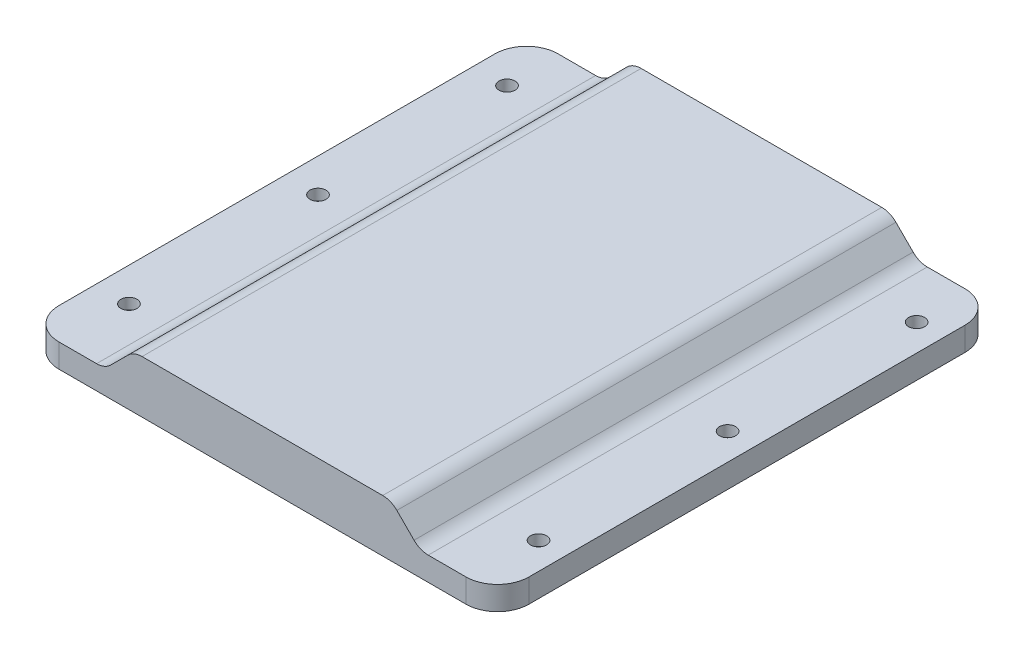
ISO-10303-21;
HEADER;
FILE_DESCRIPTION(('STEP AP214'),'2;1');
FILE_NAME('part.step','',(''),(''),'','','');
FILE_SCHEMA(('AUTOMOTIVE_DESIGN { 1 0 10303 214 1 1 1 1 }'));
ENDSEC;
DATA;
#1=APPLICATION_CONTEXT('core data for automotive mechanical design processes');
#2=APPLICATION_PROTOCOL_DEFINITION('international standard','automotive_design',2000,#1);
#3=PRODUCT_CONTEXT('',#1,'mechanical');
#4=PRODUCT('Part','Part','',(#3));
#5=PRODUCT_RELATED_PRODUCT_CATEGORY('part','',(#4));
#6=PRODUCT_DEFINITION_FORMATION('','',#4);
#7=PRODUCT_DEFINITION_CONTEXT('part definition',#1,'design');
#8=PRODUCT_DEFINITION('design','',#6,#7);
#9=PRODUCT_DEFINITION_SHAPE('','',#8);
#10=(LENGTH_UNIT() NAMED_UNIT(*) SI_UNIT(.MILLI.,.METRE.));
#11=(NAMED_UNIT(*) PLANE_ANGLE_UNIT() SI_UNIT($,.RADIAN.));
#12=(NAMED_UNIT(*) SI_UNIT($,.STERADIAN.) SOLID_ANGLE_UNIT());
#13=UNCERTAINTY_MEASURE_WITH_UNIT(LENGTH_MEASURE(1.E-05),#10,'distance_accuracy_value','');
#14=(GEOMETRIC_REPRESENTATION_CONTEXT(3) GLOBAL_UNCERTAINTY_ASSIGNED_CONTEXT((#13)) GLOBAL_UNIT_ASSIGNED_CONTEXT((#10,
#11,#12)) REPRESENTATION_CONTEXT('',''));
#15=CARTESIAN_POINT('',(0.,0.,0.));
#16=DIRECTION('',(0.,0.,1.));
#17=DIRECTION('',(1.,0.,0.));
#18=AXIS2_PLACEMENT_3D('',#15,#16,#17);
#19=CARTESIAN_POINT('',(-127.843162836829,-154.205542620135,120.));
#20=DIRECTION('',(0.,-1.,0.));
#21=DIRECTION('',(0.,0.,-1.));
#22=AXIS2_PLACEMENT_3D('',#19,#20,#21);
#23=CYLINDRICAL_SURFACE('',#22,5.1);
#24=CARTESIAN_POINT('',(-127.843162836829,-195.205542620135,120.));
#25=DIRECTION('',(0.,-1.,0.));
#26=DIRECTION('',(0.,0.,-1.));
#27=AXIS2_PLACEMENT_3D('',#24,#25,#26);
#28=CIRCLE('',#27,5.1);
#29=CARTESIAN_POINT('',(-127.843162836829,-195.205542620135,114.9));
#30=VERTEX_POINT('',#29);
#31=EDGE_CURVE('E395',#30,#30,#28,.T.);
#32=ORIENTED_EDGE('',*,*,#31,.F.);
#33=EDGE_LOOP('',(#32));
#34=FACE_BOUND('',#33,.T.);
#35=CARTESIAN_POINT('',(-127.843162836829,-202.205542620135,120.));
#36=DIRECTION('',(0.,-1.,0.));
#37=DIRECTION('',(0.,0.,-1.));
#38=AXIS2_PLACEMENT_3D('',#35,#36,#37);
#39=CIRCLE('',#38,5.1);
#40=CARTESIAN_POINT('',(-127.843162836829,-202.205542620135,114.9));
#41=VERTEX_POINT('',#40);
#42=EDGE_CURVE('E48',#41,#41,#39,.F.);
#43=ORIENTED_EDGE('',*,*,#42,.F.);
#44=EDGE_LOOP('',(#43));
#45=FACE_BOUND('',#44,.T.);
#46=ADVANCED_FACE('F44',(#34,#45),#23,.F.);
#47=CARTESIAN_POINT('',(-127.843162836829,-154.205542620135,0.));
#48=DIRECTION('',(0.,-1.,0.));
#49=DIRECTION('',(0.,0.,-1.));
#50=AXIS2_PLACEMENT_3D('',#47,#48,#49);
#51=CYLINDRICAL_SURFACE('',#50,5.1);
#52=CARTESIAN_POINT('',(-127.843162836829,-195.205542620135,0.));
#53=DIRECTION('',(0.,-1.,0.));
#54=DIRECTION('',(0.,0.,-1.));
#55=AXIS2_PLACEMENT_3D('',#52,#53,#54);
#56=CIRCLE('',#55,5.1);
#57=CARTESIAN_POINT('',(-127.843162836829,-195.205542620135,-5.1));
#58=VERTEX_POINT('',#57);
#59=EDGE_CURVE('E399',#58,#58,#56,.T.);
#60=ORIENTED_EDGE('',*,*,#59,.F.);
#61=EDGE_LOOP('',(#60));
#62=FACE_BOUND('',#61,.T.);
#63=CARTESIAN_POINT('',(-127.843162836829,-202.205542620135,0.));
#64=DIRECTION('',(0.,-1.,0.));
#65=DIRECTION('',(0.,0.,-1.));
#66=AXIS2_PLACEMENT_3D('',#63,#64,#65);
#67=CIRCLE('',#66,5.1);
#68=CARTESIAN_POINT('',(-127.843162836829,-202.205542620135,-5.1));
#69=VERTEX_POINT('',#68);
#70=EDGE_CURVE('E434',#69,#69,#67,.F.);
#71=ORIENTED_EDGE('',*,*,#70,.F.);
#72=EDGE_LOOP('',(#71));
#73=FACE_BOUND('',#72,.T.);
#74=ADVANCED_FACE('F446',(#62,#73),#51,.F.);
#75=CARTESIAN_POINT('',(-127.843162836829,-154.205542620135,-120.));
#76=DIRECTION('',(0.,-1.,0.));
#77=DIRECTION('',(0.,0.,-1.));
#78=AXIS2_PLACEMENT_3D('',#75,#76,#77);
#79=CYLINDRICAL_SURFACE('',#78,5.1);
#80=CARTESIAN_POINT('',(-127.843162836829,-195.205542620135,-120.));
#81=DIRECTION('',(0.,-1.,0.));
#82=DIRECTION('',(0.,0.,-1.));
#83=AXIS2_PLACEMENT_3D('',#80,#81,#82);
#84=CIRCLE('',#83,5.1);
#85=CARTESIAN_POINT('',(-127.843162836829,-195.205542620135,-125.1));
#86=VERTEX_POINT('',#85);
#87=EDGE_CURVE('E403',#86,#86,#84,.T.);
#88=ORIENTED_EDGE('',*,*,#87,.F.);
#89=EDGE_LOOP('',(#88));
#90=FACE_BOUND('',#89,.T.);
#91=CARTESIAN_POINT('',(-127.843162836829,-202.205542620135,-120.));
#92=DIRECTION('',(0.,-1.,0.));
#93=DIRECTION('',(0.,0.,-1.));
#94=AXIS2_PLACEMENT_3D('',#91,#92,#93);
#95=CIRCLE('',#94,5.1);
#96=CARTESIAN_POINT('',(-127.843162836829,-202.205542620135,-125.1));
#97=VERTEX_POINT('',#96);
#98=EDGE_CURVE('E431',#97,#97,#95,.F.);
#99=ORIENTED_EDGE('',*,*,#98,.F.);
#100=EDGE_LOOP('',(#99));
#101=FACE_BOUND('',#100,.T.);
#102=ADVANCED_FACE('F453',(#90,#101),#79,.F.);
#103=CARTESIAN_POINT('',(132.156837163171,-154.205542620135,-120.));
#104=DIRECTION('',(0.,-1.,0.));
#105=DIRECTION('',(0.,0.,-1.));
#106=AXIS2_PLACEMENT_3D('',#103,#104,#105);
#107=CYLINDRICAL_SURFACE('',#106,5.09999999999998);
#108=CARTESIAN_POINT('',(132.156837163171,-195.205542620135,-120.));
#109=DIRECTION('',(0.,-1.,0.));
#110=DIRECTION('',(0.,0.,-1.));
#111=AXIS2_PLACEMENT_3D('',#108,#109,#110);
#112=CIRCLE('',#111,5.09999999999998);
#113=CARTESIAN_POINT('',(132.156837163171,-195.205542620135,-125.1));
#114=VERTEX_POINT('',#113);
#115=EDGE_CURVE('E407',#114,#114,#112,.T.);
#116=ORIENTED_EDGE('',*,*,#115,.F.);
#117=EDGE_LOOP('',(#116));
#118=FACE_BOUND('',#117,.T.);
#119=CARTESIAN_POINT('',(132.156837163171,-202.205542620135,-120.));
#120=DIRECTION('',(0.,-1.,0.));
#121=DIRECTION('',(0.,0.,-1.));
#122=AXIS2_PLACEMENT_3D('',#119,#120,#121);
#123=CIRCLE('',#122,5.09999999999998);
#124=CARTESIAN_POINT('',(132.156837163171,-202.205542620135,-125.1));
#125=VERTEX_POINT('',#124);
#126=EDGE_CURVE('E427',#125,#125,#123,.F.);
#127=ORIENTED_EDGE('',*,*,#126,.F.);
#128=EDGE_LOOP('',(#127));
#129=FACE_BOUND('',#128,.T.);
#130=ADVANCED_FACE('F552',(#118,#129),#107,.F.);
#131=CARTESIAN_POINT('',(132.156837163171,-154.205542620135,120.));
#132=DIRECTION('',(0.,-1.,0.));
#133=DIRECTION('',(0.,0.,-1.));
#134=AXIS2_PLACEMENT_3D('',#131,#132,#133);
#135=CYLINDRICAL_SURFACE('',#134,5.09999999999998);
#136=CARTESIAN_POINT('',(132.156837163171,-195.205542620135,120.));
#137=DIRECTION('',(0.,-1.,0.));
#138=DIRECTION('',(0.,0.,-1.));
#139=AXIS2_PLACEMENT_3D('',#136,#137,#138);
#140=CIRCLE('',#139,5.09999999999998);
#141=CARTESIAN_POINT('',(132.156837163171,-195.205542620135,114.9));
#142=VERTEX_POINT('',#141);
#143=EDGE_CURVE('E411',#142,#142,#140,.T.);
#144=ORIENTED_EDGE('',*,*,#143,.F.);
#145=EDGE_LOOP('',(#144));
#146=FACE_BOUND('',#145,.T.);
#147=CARTESIAN_POINT('',(132.156837163171,-202.205542620135,120.));
#148=DIRECTION('',(0.,-1.,0.));
#149=DIRECTION('',(0.,0.,-1.));
#150=AXIS2_PLACEMENT_3D('',#147,#148,#149);
#151=CIRCLE('',#150,5.09999999999998);
#152=CARTESIAN_POINT('',(132.156837163171,-202.205542620135,114.9));
#153=VERTEX_POINT('',#152);
#154=EDGE_CURVE('E422',#153,#153,#151,.F.);
#155=ORIENTED_EDGE('',*,*,#154,.F.);
#156=EDGE_LOOP('',(#155));
#157=FACE_BOUND('',#156,.T.);
#158=ADVANCED_FACE('F555',(#146,#157),#135,.F.);
#159=CARTESIAN_POINT('',(132.156837163171,-154.205542620135,0.));
#160=DIRECTION('',(0.,-1.,0.));
#161=DIRECTION('',(0.,0.,-1.));
#162=AXIS2_PLACEMENT_3D('',#159,#160,#161);
#163=CYLINDRICAL_SURFACE('',#162,5.09999999999998);
#164=CARTESIAN_POINT('',(132.156837163171,-195.205542620135,0.));
#165=DIRECTION('',(0.,-1.,0.));
#166=DIRECTION('',(0.,0.,-1.));
#167=AXIS2_PLACEMENT_3D('',#164,#165,#166);
#168=CIRCLE('',#167,5.09999999999998);
#169=CARTESIAN_POINT('',(132.156837163171,-195.205542620135,-5.09999999999998));
#170=VERTEX_POINT('',#169);
#171=EDGE_CURVE('E391',#170,#170,#168,.T.);
#172=ORIENTED_EDGE('',*,*,#171,.F.);
#173=EDGE_LOOP('',(#172));
#174=FACE_BOUND('',#173,.T.);
#175=CARTESIAN_POINT('',(132.156837163171,-202.205542620135,0.));
#176=DIRECTION('',(0.,-1.,0.));
#177=DIRECTION('',(0.,0.,-1.));
#178=AXIS2_PLACEMENT_3D('',#175,#176,#177);
#179=CIRCLE('',#178,5.09999999999998);
#180=CARTESIAN_POINT('',(132.156837163171,-202.205542620135,-5.09999999999998));
#181=VERTEX_POINT('',#180);
#182=EDGE_CURVE('E418',#181,#181,#179,.F.);
#183=ORIENTED_EDGE('',*,*,#182,.F.);
#184=EDGE_LOOP('',(#183));
#185=FACE_BOUND('',#184,.T.);
#186=ADVANCED_FACE('F502',(#174,#185),#163,.F.);
#187=CARTESIAN_POINT('',(129.225,-210.205542620135,-133.670566263828));
#188=DIRECTION('',(0.,-1.,0.));
#189=DIRECTION('',(0.,0.,-1.));
#190=AXIS2_PLACEMENT_3D('',#187,#188,#189);
#191=PLANE('',#190);
#192=CARTESIAN_POINT('',(132.156837163171,-210.205542620135,0.));
#193=DIRECTION('',(0.,-1.,0.));
#194=DIRECTION('',(0.,0.,-1.));
#195=AXIS2_PLACEMENT_3D('',#192,#193,#194);
#196=CIRCLE('',#195,11.5);
#197=CARTESIAN_POINT('',(132.156837163171,-210.205542620135,-11.5));
#198=VERTEX_POINT('',#197);
#199=EDGE_CURVE('E642',#198,#198,#196,.T.);
#200=ORIENTED_EDGE('',*,*,#199,.F.);
#201=EDGE_LOOP('',(#200));
#202=FACE_BOUND('',#201,.T.);
#203=CARTESIAN_POINT('',(132.156837163171,-210.205542620135,120.));
#204=DIRECTION('',(0.,-1.,0.));
#205=DIRECTION('',(0.,0.,-1.));
#206=AXIS2_PLACEMENT_3D('',#203,#204,#205);
#207=CIRCLE('',#206,11.5);
#208=CARTESIAN_POINT('',(132.156837163171,-210.205542620135,108.5));
#209=VERTEX_POINT('',#208);
#210=EDGE_CURVE('E656',#209,#209,#207,.T.);
#211=ORIENTED_EDGE('',*,*,#210,.F.);
#212=EDGE_LOOP('',(#211));
#213=FACE_BOUND('',#212,.T.);
#214=CARTESIAN_POINT('',(-127.843162836829,-210.205542620135,-120.));
#215=DIRECTION('',(0.,-1.,0.));
#216=DIRECTION('',(0.,0.,-1.));
#217=AXIS2_PLACEMENT_3D('',#214,#215,#216);
#218=CIRCLE('',#217,11.5);
#219=CARTESIAN_POINT('',(-127.843162836829,-210.205542620135,-131.5));
#220=VERTEX_POINT('',#219);
#221=EDGE_CURVE('E621',#220,#220,#218,.T.);
#222=ORIENTED_EDGE('',*,*,#221,.F.);
#223=EDGE_LOOP('',(#222));
#224=FACE_BOUND('',#223,.T.);
#225=CARTESIAN_POINT('',(-127.843162836829,-210.205542620135,0.));
#226=DIRECTION('',(0.,-1.,0.));
#227=DIRECTION('',(0.,0.,-1.));
#228=AXIS2_PLACEMENT_3D('',#225,#226,#227);
#229=CIRCLE('',#228,11.5);
#230=CARTESIAN_POINT('',(-127.843162836829,-210.205542620135,-11.5));
#231=VERTEX_POINT('',#230);
#232=EDGE_CURVE('E622',#231,#231,#229,.T.);
#233=ORIENTED_EDGE('',*,*,#232,.F.);
#234=EDGE_LOOP('',(#233));
#235=FACE_BOUND('',#234,.T.);
#236=CARTESIAN_POINT('',(-127.843162836829,-210.205542620135,120.));
#237=DIRECTION('',(0.,-1.,0.));
#238=DIRECTION('',(0.,0.,-1.));
#239=AXIS2_PLACEMENT_3D('',#236,#237,#238);
#240=CIRCLE('',#239,11.5);
#241=CARTESIAN_POINT('',(-127.843162836829,-210.205542620135,108.5));
#242=VERTEX_POINT('',#241);
#243=EDGE_CURVE('E651',#242,#242,#240,.T.);
#244=ORIENTED_EDGE('',*,*,#243,.F.);
#245=EDGE_LOOP('',(#244));
#246=FACE_BOUND('',#245,.T.);
#247=CARTESIAN_POINT('',(132.156837163171,-210.205542620135,-120.));
#248=DIRECTION('',(0.,-1.,0.));
#249=DIRECTION('',(0.,0.,-1.));
#250=AXIS2_PLACEMENT_3D('',#247,#248,#249);
#251=CIRCLE('',#250,11.5);
#252=CARTESIAN_POINT('',(132.156837163171,-210.205542620135,-131.5));
#253=VERTEX_POINT('',#252);
#254=EDGE_CURVE('E247',#253,#253,#251,.T.);
#255=ORIENTED_EDGE('',*,*,#254,.F.);
#256=EDGE_LOOP('',(#255));
#257=FACE_BOUND('',#256,.T.);
#258=CARTESIAN_POINT('',(129.225,-210.205542620135,-133.670566263828));
#259=DIRECTION('',(0.,-1.,0.));
#260=DIRECTION('',(0.,0.,-1.));
#261=AXIS2_PLACEMENT_3D('',#258,#259,#260);
#262=CIRCLE('',#261,20.);
#263=CARTESIAN_POINT('',(129.225,-210.205542620135,-153.670566263828));
#264=VERTEX_POINT('',#263);
#265=CARTESIAN_POINT('',(149.225,-210.205542620135,-133.670566263828));
#266=VERTEX_POINT('',#265);
#267=EDGE_CURVE('E188',#264,#266,#262,.T.);
#268=ORIENTED_EDGE('',*,*,#267,.T.);
#269=DIRECTION('',(0.,0.,1.));
#270=VECTOR('',#269,1.);
#271=CARTESIAN_POINT('',(149.225,-210.205542620135,-133.670566263828));
#272=LINE('',#271,#270);
#273=CARTESIAN_POINT('',(149.225,-210.205542620135,143.130442631022));
#274=VERTEX_POINT('',#273);
#275=EDGE_CURVE('E260',#266,#274,#272,.T.);
#276=ORIENTED_EDGE('',*,*,#275,.T.);
#277=CARTESIAN_POINT('',(129.225,-210.205542620135,143.130442631022));
#278=DIRECTION('',(0.,-1.,0.));
#279=DIRECTION('',(0.,0.,-1.));
#280=AXIS2_PLACEMENT_3D('',#277,#278,#279);
#281=CIRCLE('',#280,20.);
#282=CARTESIAN_POINT('',(129.225,-210.205542620135,163.130442631022));
#283=VERTEX_POINT('',#282);
#284=EDGE_CURVE('E275',#274,#283,#281,.T.);
#285=ORIENTED_EDGE('',*,*,#284,.T.);
#286=DIRECTION('',(-1.,0.,0.));
#287=VECTOR('',#286,1.);
#288=CARTESIAN_POINT('',(129.225,-210.205542620135,163.130442631022));
#289=LINE('',#288,#287);
#290=CARTESIAN_POINT('',(-129.128934405313,-210.205542620135,163.130442631022));
#291=VERTEX_POINT('',#290);
#292=EDGE_CURVE('E329',#283,#291,#289,.T.);
#293=ORIENTED_EDGE('',*,*,#292,.T.);
#294=CARTESIAN_POINT('',(-129.128934405313,-210.205542620135,143.130442631022));
#295=DIRECTION('',(0.,-1.,0.));
#296=DIRECTION('',(0.,0.,-1.));
#297=AXIS2_PLACEMENT_3D('',#294,#295,#296);
#298=CIRCLE('',#297,20.);
#299=CARTESIAN_POINT('',(-149.128934405314,-210.205542620135,143.130442631022));
#300=VERTEX_POINT('',#299);
#301=EDGE_CURVE('E286',#291,#300,#298,.T.);
#302=ORIENTED_EDGE('',*,*,#301,.T.);
#303=DIRECTION('',(0.,0.,-1.));
#304=VECTOR('',#303,1.);
#305=CARTESIAN_POINT('',(-149.128934405314,-210.205542620135,143.130442631022));
#306=LINE('',#305,#304);
#307=CARTESIAN_POINT('',(-149.128934405314,-210.205542620135,-133.670566263828));
#308=VERTEX_POINT('',#307);
#309=EDGE_CURVE('E265',#300,#308,#306,.T.);
#310=ORIENTED_EDGE('',*,*,#309,.T.);
#311=CARTESIAN_POINT('',(-129.128934405313,-210.205542620135,-133.670566263828));
#312=DIRECTION('',(0.,-1.,0.));
#313=DIRECTION('',(0.,0.,-1.));
#314=AXIS2_PLACEMENT_3D('',#311,#312,#313);
#315=CIRCLE('',#314,20.);
#316=CARTESIAN_POINT('',(-129.128934405313,-210.205542620135,-153.670566263828));
#317=VERTEX_POINT('',#316);
#318=EDGE_CURVE('E307',#308,#317,#315,.T.);
#319=ORIENTED_EDGE('',*,*,#318,.T.);
#320=DIRECTION('',(1.,0.,0.));
#321=VECTOR('',#320,1.);
#322=CARTESIAN_POINT('',(-129.128934405313,-210.205542620135,-153.670566263828));
#323=LINE('',#322,#321);
#324=EDGE_CURVE('E254',#317,#264,#323,.T.);
#325=ORIENTED_EDGE('',*,*,#324,.T.);
#326=EDGE_LOOP('',(#268,#276,#285,#293,#302,#310,#319,#325));
#327=FACE_BOUND('',#326,.T.);
#328=ADVANCED_FACE('F477',(#202,#213,#224,#235,#246,#257,#327),#191,.T.);
#329=CARTESIAN_POINT('',(76.3840368888061,-189.565186447984,-153.670566263828));
#330=DIRECTION('',(0.,0.,1.));
#331=DIRECTION('',(1.,0.,0.));
#332=AXIS2_PLACEMENT_3D('',#329,#330,#331);
#333=CYLINDRICAL_SURFACE('',#332,12.7);
#334=DIRECTION('',(0.,0.,1.));
#335=VECTOR('',#334,1.);
#336=CARTESIAN_POINT('',(85.35965921701,-180.580298923844,-153.670566263828));
#337=LINE('',#336,#335);
#338=CARTESIAN_POINT('',(85.35965921701,-180.580298923844,-153.670566263828));
#339=VERTEX_POINT('',#338);
#340=CARTESIAN_POINT('',(85.35965921701,-180.580298923844,163.130442631022));
#341=VERTEX_POINT('',#340);
#342=EDGE_CURVE('E11',#339,#341,#337,.T.);
#343=ORIENTED_EDGE('',*,*,#342,.F.);
#344=CARTESIAN_POINT('',(76.3840368888061,-189.565186447984,-153.670566263828));
#345=DIRECTION('',(0.,0.,-1.));
#346=DIRECTION('',(1.,0.,0.));
#347=AXIS2_PLACEMENT_3D('',#344,#345,#346);
#348=CIRCLE('',#347,12.7);
#349=CARTESIAN_POINT('',(76.3840368888061,-176.865186447984,-153.670566263828));
#350=VERTEX_POINT('',#349);
#351=EDGE_CURVE('E221',#350,#339,#348,.T.);
#352=ORIENTED_EDGE('',*,*,#351,.F.);
#353=DIRECTION('',(0.,0.,1.));
#354=VECTOR('',#353,1.);
#355=CARTESIAN_POINT('',(76.384036888806,-176.865186447984,-153.670566263828));
#356=LINE('',#355,#354);
#357=CARTESIAN_POINT('',(76.3840368888061,-176.865186447984,163.130442631022));
#358=VERTEX_POINT('',#357);
#359=EDGE_CURVE('E135',#350,#358,#356,.T.);
#360=ORIENTED_EDGE('',*,*,#359,.T.);
#361=CARTESIAN_POINT('',(76.3840368888061,-189.565186447984,163.130442631022));
#362=DIRECTION('',(0.,0.,-1.));
#363=DIRECTION('',(1.,0.,0.));
#364=AXIS2_PLACEMENT_3D('',#361,#362,#363);
#365=CIRCLE('',#364,12.7);
#366=EDGE_CURVE('E218',#358,#341,#365,.T.);
#367=ORIENTED_EDGE('',*,*,#366,.T.);
#368=EDGE_LOOP('',(#343,#352,#360,#367));
#369=FACE_BOUND('',#368,.T.);
#370=ADVANCED_FACE('F216',(#369),#333,.T.);
#371=CARTESIAN_POINT('',(105.256674882048,-195.205542620135,-153.670566263828));
#372=DIRECTION('',(0.,-1.,0.));
#373=DIRECTION('',(0.,0.,-1.));
#374=AXIS2_PLACEMENT_3D('',#371,#372,#373);
#375=PLANE('',#374);
#376=ORIENTED_EDGE('',*,*,#171,.T.);
#377=EDGE_LOOP('',(#376));
#378=FACE_BOUND('',#377,.T.);
#379=ORIENTED_EDGE('',*,*,#143,.T.);
#380=EDGE_LOOP('',(#379));
#381=FACE_BOUND('',#380,.T.);
#382=ORIENTED_EDGE('',*,*,#115,.T.);
#383=EDGE_LOOP('',(#382));
#384=FACE_BOUND('',#383,.T.);
#385=DIRECTION('',(-1.,0.,0.));
#386=VECTOR('',#385,1.);
#387=CARTESIAN_POINT('',(185.,-195.205542620135,163.130442631022));
#388=LINE('',#387,#386);
#389=CARTESIAN_POINT('',(129.225,-195.205542620135,163.130442631022));
#390=VERTEX_POINT('',#389);
#391=CARTESIAN_POINT('',(105.256674882048,-195.205542620135,163.130442631022));
#392=VERTEX_POINT('',#391);
#393=EDGE_CURVE('E328',#390,#392,#388,.T.);
#394=ORIENTED_EDGE('',*,*,#393,.F.);
#395=CARTESIAN_POINT('',(129.225,-195.205542620135,143.130442631022));
#396=DIRECTION('',(0.,1.,0.));
#397=DIRECTION('',(0.,0.,-1.));
#398=AXIS2_PLACEMENT_3D('',#395,#396,#397);
#399=CIRCLE('',#398,20.);
#400=CARTESIAN_POINT('',(149.225,-195.205542620135,143.130442631022));
#401=VERTEX_POINT('',#400);
#402=EDGE_CURVE('E278',#390,#401,#399,.T.);
#403=ORIENTED_EDGE('',*,*,#402,.T.);
#404=DIRECTION('',(0.,0.,1.));
#405=VECTOR('',#404,1.);
#406=CARTESIAN_POINT('',(149.225,-195.205542620135,-153.670566263828));
#407=LINE('',#406,#405);
#408=CARTESIAN_POINT('',(149.225,-195.205542620135,-133.670566263828));
#409=VERTEX_POINT('',#408);
#410=EDGE_CURVE('E259',#409,#401,#407,.T.);
#411=ORIENTED_EDGE('',*,*,#410,.F.);
#412=CARTESIAN_POINT('',(129.225,-195.205542620135,-133.670566263828));
#413=DIRECTION('',(0.,1.,0.));
#414=DIRECTION('',(0.,0.,-1.));
#415=AXIS2_PLACEMENT_3D('',#412,#413,#414);
#416=CIRCLE('',#415,20.);
#417=CARTESIAN_POINT('',(129.225,-195.205542620135,-153.670566263828));
#418=VERTEX_POINT('',#417);
#419=EDGE_CURVE('E200',#409,#418,#416,.T.);
#420=ORIENTED_EDGE('',*,*,#419,.T.);
#421=DIRECTION('',(1.,0.,0.));
#422=VECTOR('',#421,1.);
#423=CARTESIAN_POINT('',(105.256674882048,-195.205542620135,-153.670566263828));
#424=LINE('',#423,#422);
#425=CARTESIAN_POINT('',(105.256674882048,-195.205542620135,-153.670566263828));
#426=VERTEX_POINT('',#425);
#427=EDGE_CURVE('E322',#426,#418,#424,.T.);
#428=ORIENTED_EDGE('',*,*,#427,.F.);
#429=DIRECTION('',(0.,0.,1.));
#430=VECTOR('',#429,1.);
#431=CARTESIAN_POINT('',(105.256674882048,-195.205542620135,-153.670566263828));
#432=LINE('',#431,#430);
#433=EDGE_CURVE('E299',#426,#392,#432,.T.);
#434=ORIENTED_EDGE('',*,*,#433,.T.);
#435=EDGE_LOOP('',(#394,#403,#411,#420,#428,#434));
#436=FACE_BOUND('',#435,.T.);
#437=ADVANCED_FACE('F46',(#378,#381,#384,#436),#375,.F.);
#438=CARTESIAN_POINT('',(96.2810525538444,-191.490430144275,-153.670566263828));
#439=DIRECTION('',(-0.7067419156066,-0.707471458593711,0.));
#440=DIRECTION('',(-0.707471458593711,0.7067419156066,0.));
#441=AXIS2_PLACEMENT_3D('',#438,#439,#440);
#442=PLANE('',#441);
#443=DIRECTION('',(0.,0.,1.));
#444=VECTOR('',#443,1.);
#445=CARTESIAN_POINT('',(96.2810525538444,-191.490430144275,-153.670566263828));
#446=LINE('',#445,#444);
#447=CARTESIAN_POINT('',(96.2810525538444,-191.490430144275,-153.670566263828));
#448=VERTEX_POINT('',#447);
#449=CARTESIAN_POINT('',(96.2810525538444,-191.490430144275,163.130442631022));
#450=VERTEX_POINT('',#449);
#451=EDGE_CURVE('E55',#448,#450,#446,.T.);
#452=ORIENTED_EDGE('',*,*,#451,.F.);
#453=DIRECTION('',(0.707471458593711,-0.7067419156066,0.));
#454=VECTOR('',#453,1.);
#455=CARTESIAN_POINT('',(96.2810525538444,-191.490430144275,-153.670566263828));
#456=LINE('',#455,#454);
#457=EDGE_CURVE('E323',#339,#448,#456,.T.);
#458=ORIENTED_EDGE('',*,*,#457,.F.);
#459=ORIENTED_EDGE('',*,*,#342,.T.);
#460=DIRECTION('',(0.707471458593711,-0.7067419156066,0.));
#461=VECTOR('',#460,1.);
#462=CARTESIAN_POINT('',(96.2810525538444,-191.490430144275,163.130442631022));
#463=LINE('',#462,#461);
#464=EDGE_CURVE('E238',#341,#450,#463,.T.);
#465=ORIENTED_EDGE('',*,*,#464,.T.);
#466=EDGE_LOOP('',(#452,#458,#459,#465));
#467=FACE_BOUND('',#466,.T.);
#468=ADVANCED_FACE('F473',(#467),#442,.F.);
#469=CARTESIAN_POINT('',(105.256674882048,-182.505542620135,-153.670566263828));
#470=DIRECTION('',(0.,0.,1.));
#471=DIRECTION('',(1.,0.,0.));
#472=AXIS2_PLACEMENT_3D('',#469,#470,#471);
#473=CYLINDRICAL_SURFACE('',#472,12.7);
#474=ORIENTED_EDGE('',*,*,#433,.F.);
#475=CARTESIAN_POINT('',(105.256674882048,-182.505542620135,-153.670566263828));
#476=DIRECTION('',(0.,0.,1.));
#477=DIRECTION('',(1.,0.,0.));
#478=AXIS2_PLACEMENT_3D('',#475,#476,#477);
#479=CIRCLE('',#478,12.7);
#480=EDGE_CURVE('E318',#448,#426,#479,.T.);
#481=ORIENTED_EDGE('',*,*,#480,.F.);
#482=ORIENTED_EDGE('',*,*,#451,.T.);
#483=CARTESIAN_POINT('',(105.256674882048,-182.505542620135,163.130442631022));
#484=DIRECTION('',(0.,0.,1.));
#485=DIRECTION('',(1.,0.,0.));
#486=AXIS2_PLACEMENT_3D('',#483,#484,#485);
#487=CIRCLE('',#486,12.7);
#488=EDGE_CURVE('E243',#450,#392,#487,.T.);
#489=ORIENTED_EDGE('',*,*,#488,.T.);
#490=EDGE_LOOP('',(#474,#481,#482,#489));
#491=FACE_BOUND('',#490,.T.);
#492=ADVANCED_FACE('F470',(#491),#473,.F.);
#493=CARTESIAN_POINT('',(-85.3596592170099,-180.580298923844,-153.670566263828));
#494=DIRECTION('',(0.7067419156066,-0.707471458593711,0.));
#495=DIRECTION('',(0.,0.,-1.));
#496=AXIS2_PLACEMENT_3D('',#493,#494,#495);
#497=PLANE('',#496);
#498=DIRECTION('',(0.,0.,1.));
#499=VECTOR('',#498,1.);
#500=CARTESIAN_POINT('',(-85.3596592170099,-180.580298923844,-153.670566263828));
#501=LINE('',#500,#499);
#502=CARTESIAN_POINT('',(-85.3596592170099,-180.580298923844,-153.670566263828));
#503=VERTEX_POINT('',#502);
#504=CARTESIAN_POINT('',(-85.3596592170099,-180.580298923844,163.130442631022));
#505=VERTEX_POINT('',#504);
#506=EDGE_CURVE('E297',#503,#505,#501,.T.);
#507=ORIENTED_EDGE('',*,*,#506,.F.);
#508=DIRECTION('',(0.707471458593711,0.7067419156066,0.));
#509=VECTOR('',#508,1.);
#510=CARTESIAN_POINT('',(-85.3596592170099,-180.580298923844,-153.670566263828));
#511=LINE('',#510,#509);
#512=CARTESIAN_POINT('',(-96.2810525538443,-191.490430144275,-153.670566263828));
#513=VERTEX_POINT('',#512);
#514=EDGE_CURVE('E283',#513,#503,#511,.T.);
#515=ORIENTED_EDGE('',*,*,#514,.F.);
#516=DIRECTION('',(0.,0.,1.));
#517=VECTOR('',#516,1.);
#518=CARTESIAN_POINT('',(-96.2810525538443,-191.490430144275,-153.670566263828));
#519=LINE('',#518,#517);
#520=CARTESIAN_POINT('',(-96.2810525538443,-191.490430144275,163.130442631022));
#521=VERTEX_POINT('',#520);
#522=EDGE_CURVE('E296',#513,#521,#519,.T.);
#523=ORIENTED_EDGE('',*,*,#522,.T.);
#524=DIRECTION('',(0.707471458593711,0.7067419156066,0.));
#525=VECTOR('',#524,1.);
#526=CARTESIAN_POINT('',(-85.3596592170099,-180.580298923844,163.130442631022));
#527=LINE('',#526,#525);
#528=EDGE_CURVE('E308',#521,#505,#527,.T.);
#529=ORIENTED_EDGE('',*,*,#528,.T.);
#530=EDGE_LOOP('',(#507,#515,#523,#529));
#531=FACE_BOUND('',#530,.T.);
#532=ADVANCED_FACE('F469',(#531),#497,.F.);
#533=CARTESIAN_POINT('',(-76.3840368888061,-189.565186447984,-153.670566263828));
#534=DIRECTION('',(0.,0.,1.));
#535=DIRECTION('',(1.,0.,0.));
#536=AXIS2_PLACEMENT_3D('',#533,#534,#535);
#537=CYLINDRICAL_SURFACE('',#536,12.7);
#538=DIRECTION('',(0.,0.,1.));
#539=VECTOR('',#538,1.);
#540=CARTESIAN_POINT('',(-76.3840368888062,-176.865186447984,-153.670566263828));
#541=LINE('',#540,#539);
#542=CARTESIAN_POINT('',(-76.3840368888062,-176.865186447984,-153.670566263828));
#543=VERTEX_POINT('',#542);
#544=CARTESIAN_POINT('',(-76.3840368888061,-176.865186447984,163.130442631022));
#545=VERTEX_POINT('',#544);
#546=EDGE_CURVE('E151',#543,#545,#541,.T.);
#547=ORIENTED_EDGE('',*,*,#546,.F.);
#548=CARTESIAN_POINT('',(-76.3840368888061,-189.565186447984,-153.670566263828));
#549=DIRECTION('',(0.,0.,-1.));
#550=DIRECTION('',(1.,0.,0.));
#551=AXIS2_PLACEMENT_3D('',#548,#549,#550);
#552=CIRCLE('',#551,12.7);
#553=EDGE_CURVE('E330',#503,#543,#552,.T.);
#554=ORIENTED_EDGE('',*,*,#553,.F.);
#555=ORIENTED_EDGE('',*,*,#506,.T.);
#556=CARTESIAN_POINT('',(-76.3840368888061,-189.565186447984,163.130442631022));
#557=DIRECTION('',(0.,0.,-1.));
#558=DIRECTION('',(1.,0.,0.));
#559=AXIS2_PLACEMENT_3D('',#556,#557,#558);
#560=CIRCLE('',#559,12.7);
#561=EDGE_CURVE('E232',#505,#545,#560,.T.);
#562=ORIENTED_EDGE('',*,*,#561,.T.);
#563=EDGE_LOOP('',(#547,#554,#555,#562));
#564=FACE_BOUND('',#563,.T.);
#565=ADVANCED_FACE('F465',(#564),#537,.T.);
#566=CARTESIAN_POINT('',(-105.256674882048,-182.505542620135,-153.670566263828));
#567=DIRECTION('',(0.,0.,1.));
#568=DIRECTION('',(1.,0.,0.));
#569=AXIS2_PLACEMENT_3D('',#566,#567,#568);
#570=CYLINDRICAL_SURFACE('',#569,12.7);
#571=ORIENTED_EDGE('',*,*,#522,.F.);
#572=CARTESIAN_POINT('',(-105.256674882048,-182.505542620135,-153.670566263828));
#573=DIRECTION('',(0.,0.,1.));
#574=DIRECTION('',(1.,0.,0.));
#575=AXIS2_PLACEMENT_3D('',#572,#573,#574);
#576=CIRCLE('',#575,12.7);
#577=CARTESIAN_POINT('',(-105.256674882048,-195.205542620135,-153.670566263828));
#578=VERTEX_POINT('',#577);
#579=EDGE_CURVE('E279',#578,#513,#576,.T.);
#580=ORIENTED_EDGE('',*,*,#579,.F.);
#581=DIRECTION('',(0.,0.,1.));
#582=VECTOR('',#581,1.);
#583=CARTESIAN_POINT('',(-105.256674882048,-195.205542620135,-153.670566263828));
#584=LINE('',#583,#582);
#585=CARTESIAN_POINT('',(-105.256674882048,-195.205542620135,163.130442631022));
#586=VERTEX_POINT('',#585);
#587=EDGE_CURVE('E293',#578,#586,#584,.T.);
#588=ORIENTED_EDGE('',*,*,#587,.T.);
#589=CARTESIAN_POINT('',(-105.256674882048,-182.505542620135,163.130442631022));
#590=DIRECTION('',(0.,0.,1.));
#591=DIRECTION('',(1.,0.,0.));
#592=AXIS2_PLACEMENT_3D('',#589,#590,#591);
#593=CIRCLE('',#592,12.7);
#594=EDGE_CURVE('E312',#586,#521,#593,.T.);
#595=ORIENTED_EDGE('',*,*,#594,.T.);
#596=EDGE_LOOP('',(#571,#580,#588,#595));
#597=FACE_BOUND('',#596,.T.);
#598=ADVANCED_FACE('F468',(#597),#570,.F.);
#599=CARTESIAN_POINT('',(-166.497256742306,-195.205542620135,-153.670566263828));
#600=DIRECTION('',(0.,-1.,0.));
#601=DIRECTION('',(0.,0.,-1.));
#602=AXIS2_PLACEMENT_3D('',#599,#600,#601);
#603=PLANE('',#602);
#604=ORIENTED_EDGE('',*,*,#87,.T.);
#605=EDGE_LOOP('',(#604));
#606=FACE_BOUND('',#605,.T.);
#607=ORIENTED_EDGE('',*,*,#59,.T.);
#608=EDGE_LOOP('',(#607));
#609=FACE_BOUND('',#608,.T.);
#610=ORIENTED_EDGE('',*,*,#31,.T.);
#611=EDGE_LOOP('',(#610));
#612=FACE_BOUND('',#611,.T.);
#613=DIRECTION('',(0.,0.,-1.));
#614=VECTOR('',#613,1.);
#615=CARTESIAN_POINT('',(-149.128934405314,-195.205542620135,-153.670566263828));
#616=LINE('',#615,#614);
#617=CARTESIAN_POINT('',(-149.128934405314,-195.205542620135,143.130442631022));
#618=VERTEX_POINT('',#617);
#619=CARTESIAN_POINT('',(-149.128934405313,-195.205542620135,-133.670566263828));
#620=VERTEX_POINT('',#619);
#621=EDGE_CURVE('E270',#618,#620,#616,.T.);
#622=ORIENTED_EDGE('',*,*,#621,.F.);
#623=CARTESIAN_POINT('',(-129.128934405313,-195.205542620135,143.130442631022));
#624=DIRECTION('',(0.,1.,0.));
#625=DIRECTION('',(0.,0.,-1.));
#626=AXIS2_PLACEMENT_3D('',#623,#624,#625);
#627=CIRCLE('',#626,20.);
#628=CARTESIAN_POINT('',(-129.128934405313,-195.205542620135,163.130442631022));
#629=VERTEX_POINT('',#628);
#630=EDGE_CURVE('E224',#618,#629,#627,.T.);
#631=ORIENTED_EDGE('',*,*,#630,.T.);
#632=DIRECTION('',(-1.,0.,0.));
#633=VECTOR('',#632,1.);
#634=CARTESIAN_POINT('',(185.,-195.205542620135,163.130442631022));
#635=LINE('',#634,#633);
#636=EDGE_CURVE('E348',#586,#629,#635,.T.);
#637=ORIENTED_EDGE('',*,*,#636,.F.);
#638=ORIENTED_EDGE('',*,*,#587,.F.);
#639=DIRECTION('',(1.,0.,0.));
#640=VECTOR('',#639,1.);
#641=CARTESIAN_POINT('',(-166.497256742306,-195.205542620135,-153.670566263828));
#642=LINE('',#641,#640);
#643=CARTESIAN_POINT('',(-129.128934405313,-195.205542620135,-153.670566263828));
#644=VERTEX_POINT('',#643);
#645=EDGE_CURVE('E253',#644,#578,#642,.T.);
#646=ORIENTED_EDGE('',*,*,#645,.F.);
#647=CARTESIAN_POINT('',(-129.128934405313,-195.205542620135,-133.670566263828));
#648=DIRECTION('',(0.,1.,0.));
#649=DIRECTION('',(0.,0.,-1.));
#650=AXIS2_PLACEMENT_3D('',#647,#648,#649);
#651=CIRCLE('',#650,20.);
#652=EDGE_CURVE('E69',#644,#620,#651,.T.);
#653=ORIENTED_EDGE('',*,*,#652,.T.);
#654=EDGE_LOOP('',(#622,#631,#637,#638,#646,#653));
#655=FACE_BOUND('',#654,.T.);
#656=ADVANCED_FACE('F498',(#606,#609,#612,#655),#603,.F.);
#657=CARTESIAN_POINT('',(129.225,-176.865186447984,-133.670566263828));
#658=DIRECTION('',(0.,1.,0.));
#659=DIRECTION('',(1.,0.,0.));
#660=AXIS2_PLACEMENT_3D('',#657,#658,#659);
#661=PLANE('',#660);
#662=DIRECTION('',(1.,0.,0.));
#663=VECTOR('',#662,1.);
#664=CARTESIAN_POINT('',(129.225,-176.865186447984,163.130442631022));
#665=LINE('',#664,#663);
#666=EDGE_CURVE('E227',#545,#358,#665,.T.);
#667=ORIENTED_EDGE('',*,*,#666,.T.);
#668=ORIENTED_EDGE('',*,*,#359,.F.);
#669=DIRECTION('',(-1.,0.,0.));
#670=VECTOR('',#669,1.);
#671=CARTESIAN_POINT('',(129.225,-176.865186447984,-153.670566263828));
#672=LINE('',#671,#670);
#673=EDGE_CURVE('E334',#350,#543,#672,.T.);
#674=ORIENTED_EDGE('',*,*,#673,.T.);
#675=ORIENTED_EDGE('',*,*,#546,.T.);
#676=EDGE_LOOP('',(#667,#668,#674,#675));
#677=FACE_BOUND('',#676,.T.);
#678=ADVANCED_FACE('F228',(#677),#661,.T.);
#679=CARTESIAN_POINT('',(-129.128934405313,-195.205542620135,143.130442631022));
#680=DIRECTION('',(0.,-1.,0.));
#681=DIRECTION('',(0.,0.,-1.));
#682=AXIS2_PLACEMENT_3D('',#679,#680,#681);
#683=CYLINDRICAL_SURFACE('',#682,20.);
#684=DIRECTION('',(0.,1.,0.));
#685=VECTOR('',#684,1.);
#686=CARTESIAN_POINT('',(-149.128934405314,-195.205542620135,143.130442631022));
#687=LINE('',#686,#685);
#688=EDGE_CURVE('E269',#300,#618,#687,.T.);
#689=ORIENTED_EDGE('',*,*,#688,.F.);
#690=ORIENTED_EDGE('',*,*,#301,.F.);
#691=DIRECTION('',(0.,-1.,0.));
#692=VECTOR('',#691,1.);
#693=CARTESIAN_POINT('',(-129.128934405313,-195.205542620135,163.130442631022));
#694=LINE('',#693,#692);
#695=EDGE_CURVE('E303',#629,#291,#694,.T.);
#696=ORIENTED_EDGE('',*,*,#695,.F.);
#697=ORIENTED_EDGE('',*,*,#630,.F.);
#698=EDGE_LOOP('',(#689,#690,#696,#697));
#699=FACE_BOUND('',#698,.T.);
#700=ADVANCED_FACE('F509',(#699),#683,.T.);
#701=CARTESIAN_POINT('',(129.225,-195.205542620135,143.130442631022));
#702=DIRECTION('',(0.,1.,0.));
#703=DIRECTION('',(0.,0.,1.));
#704=AXIS2_PLACEMENT_3D('',#701,#702,#703);
#705=CYLINDRICAL_SURFACE('',#704,20.);
#706=DIRECTION('',(0.,1.,0.));
#707=VECTOR('',#706,1.);
#708=CARTESIAN_POINT('',(129.225,-195.205542620135,163.130442631022));
#709=LINE('',#708,#707);
#710=EDGE_CURVE('E324',#283,#390,#709,.T.);
#711=ORIENTED_EDGE('',*,*,#710,.F.);
#712=ORIENTED_EDGE('',*,*,#284,.F.);
#713=DIRECTION('',(0.,-1.,0.));
#714=VECTOR('',#713,1.);
#715=CARTESIAN_POINT('',(149.225,-195.205542620135,143.130442631022));
#716=LINE('',#715,#714);
#717=EDGE_CURVE('E261',#401,#274,#716,.T.);
#718=ORIENTED_EDGE('',*,*,#717,.F.);
#719=ORIENTED_EDGE('',*,*,#402,.F.);
#720=EDGE_LOOP('',(#711,#712,#718,#719));
#721=FACE_BOUND('',#720,.T.);
#722=ADVANCED_FACE('F484',(#721),#705,.T.);
#723=CARTESIAN_POINT('',(129.225,-195.205542620135,-133.670566263828));
#724=DIRECTION('',(0.,-1.,0.));
#725=DIRECTION('',(0.,0.,-1.));
#726=AXIS2_PLACEMENT_3D('',#723,#724,#725);
#727=CYLINDRICAL_SURFACE('',#726,20.);
#728=DIRECTION('',(0.,1.,0.));
#729=VECTOR('',#728,1.);
#730=CARTESIAN_POINT('',(149.225,-195.205542620135,-133.670566263828));
#731=LINE('',#730,#729);
#732=EDGE_CURVE('E255',#266,#409,#731,.T.);
#733=ORIENTED_EDGE('',*,*,#732,.F.);
#734=ORIENTED_EDGE('',*,*,#267,.F.);
#735=DIRECTION('',(0.,-1.,0.));
#736=VECTOR('',#735,1.);
#737=CARTESIAN_POINT('',(129.225,-195.205542620135,-153.670566263828));
#738=LINE('',#737,#736);
#739=EDGE_CURVE('E289',#418,#264,#738,.T.);
#740=ORIENTED_EDGE('',*,*,#739,.F.);
#741=ORIENTED_EDGE('',*,*,#419,.F.);
#742=EDGE_LOOP('',(#733,#734,#740,#741));
#743=FACE_BOUND('',#742,.T.);
#744=ADVANCED_FACE('F481',(#743),#727,.T.);
#745=CARTESIAN_POINT('',(-129.128934405313,-195.205542620135,-133.670566263828));
#746=DIRECTION('',(0.,1.,0.));
#747=DIRECTION('',(0.,0.,1.));
#748=AXIS2_PLACEMENT_3D('',#745,#746,#747);
#749=CYLINDRICAL_SURFACE('',#748,20.);
#750=DIRECTION('',(0.,1.,0.));
#751=VECTOR('',#750,1.);
#752=CARTESIAN_POINT('',(-129.128934405313,-195.205542620135,-153.670566263828));
#753=LINE('',#752,#751);
#754=EDGE_CURVE('E249',#317,#644,#753,.T.);
#755=ORIENTED_EDGE('',*,*,#754,.F.);
#756=ORIENTED_EDGE('',*,*,#318,.F.);
#757=DIRECTION('',(0.,-1.,0.));
#758=VECTOR('',#757,1.);
#759=CARTESIAN_POINT('',(-149.128934405314,-195.205542620135,-133.670566263828));
#760=LINE('',#759,#758);
#761=EDGE_CURVE('E274',#620,#308,#760,.T.);
#762=ORIENTED_EDGE('',*,*,#761,.F.);
#763=ORIENTED_EDGE('',*,*,#652,.F.);
#764=EDGE_LOOP('',(#755,#756,#762,#763));
#765=FACE_BOUND('',#764,.T.);
#766=ADVANCED_FACE('F463',(#765),#749,.T.);
#767=CARTESIAN_POINT('',(-149.128934405314,-195.205542620135,-153.670566263828));
#768=DIRECTION('',(1.,0.,0.));
#769=DIRECTION('',(0.,1.,0.));
#770=AXIS2_PLACEMENT_3D('',#767,#768,#769);
#771=PLANE('',#770);
#772=ORIENTED_EDGE('',*,*,#309,.F.);
#773=ORIENTED_EDGE('',*,*,#688,.T.);
#774=ORIENTED_EDGE('',*,*,#621,.T.);
#775=ORIENTED_EDGE('',*,*,#761,.T.);
#776=EDGE_LOOP('',(#772,#773,#774,#775));
#777=FACE_BOUND('',#776,.T.);
#778=ADVANCED_FACE('F459',(#777),#771,.F.);
#779=CARTESIAN_POINT('',(149.225,-195.205542620135,-153.670566263828));
#780=DIRECTION('',(-1.,0.,0.));
#781=DIRECTION('',(0.,0.,1.));
#782=AXIS2_PLACEMENT_3D('',#779,#780,#781);
#783=PLANE('',#782);
#784=ORIENTED_EDGE('',*,*,#275,.F.);
#785=ORIENTED_EDGE('',*,*,#732,.T.);
#786=ORIENTED_EDGE('',*,*,#410,.T.);
#787=ORIENTED_EDGE('',*,*,#717,.T.);
#788=EDGE_LOOP('',(#784,#785,#786,#787));
#789=FACE_BOUND('',#788,.T.);
#790=ADVANCED_FACE('F462',(#789),#783,.F.);
#791=CARTESIAN_POINT('',(185.,-195.205542620135,-153.670566263828));
#792=DIRECTION('',(0.,0.,1.));
#793=DIRECTION('',(1.,0.,0.));
#794=AXIS2_PLACEMENT_3D('',#791,#792,#793);
#795=PLANE('',#794);
#796=ORIENTED_EDGE('',*,*,#324,.F.);
#797=ORIENTED_EDGE('',*,*,#754,.T.);
#798=ORIENTED_EDGE('',*,*,#645,.T.);
#799=ORIENTED_EDGE('',*,*,#579,.T.);
#800=ORIENTED_EDGE('',*,*,#514,.T.);
#801=ORIENTED_EDGE('',*,*,#553,.T.);
#802=ORIENTED_EDGE('',*,*,#673,.F.);
#803=ORIENTED_EDGE('',*,*,#351,.T.);
#804=ORIENTED_EDGE('',*,*,#457,.T.);
#805=ORIENTED_EDGE('',*,*,#480,.T.);
#806=ORIENTED_EDGE('',*,*,#427,.T.);
#807=ORIENTED_EDGE('',*,*,#739,.T.);
#808=EDGE_LOOP('',(#796,#797,#798,#799,#800,#801,#802,#803,#804,#805,#806,#807));
#809=FACE_BOUND('',#808,.T.);
#810=ADVANCED_FACE('F489',(#809),#795,.F.);
#811=CARTESIAN_POINT('',(185.,-195.205542620135,163.130442631022));
#812=DIRECTION('',(0.,0.,-1.));
#813=DIRECTION('',(0.,-1.,0.));
#814=AXIS2_PLACEMENT_3D('',#811,#812,#813);
#815=PLANE('',#814);
#816=ORIENTED_EDGE('',*,*,#292,.F.);
#817=ORIENTED_EDGE('',*,*,#710,.T.);
#818=ORIENTED_EDGE('',*,*,#393,.T.);
#819=ORIENTED_EDGE('',*,*,#488,.F.);
#820=ORIENTED_EDGE('',*,*,#464,.F.);
#821=ORIENTED_EDGE('',*,*,#366,.F.);
#822=ORIENTED_EDGE('',*,*,#666,.F.);
#823=ORIENTED_EDGE('',*,*,#561,.F.);
#824=ORIENTED_EDGE('',*,*,#528,.F.);
#825=ORIENTED_EDGE('',*,*,#594,.F.);
#826=ORIENTED_EDGE('',*,*,#636,.T.);
#827=ORIENTED_EDGE('',*,*,#695,.T.);
#828=EDGE_LOOP('',(#816,#817,#818,#819,#820,#821,#822,#823,#824,#825,#826,#827));
#829=FACE_BOUND('',#828,.T.);
#830=ADVANCED_FACE('F235',(#829),#815,.F.);
#831=CARTESIAN_POINT('',(132.156837163171,-202.205542620135,0.));
#832=DIRECTION('',(0.,-1.,0.));
#833=DIRECTION('',(0.,0.,-1.));
#834=AXIS2_PLACEMENT_3D('',#831,#832,#833);
#835=PLANE('',#834);
#836=CARTESIAN_POINT('',(132.156837163171,-202.205542620135,0.));
#837=DIRECTION('',(0.,-1.,0.));
#838=DIRECTION('',(0.,0.,-1.));
#839=AXIS2_PLACEMENT_3D('',#836,#837,#838);
#840=CIRCLE('',#839,11.5);
#841=CARTESIAN_POINT('',(132.156837163171,-202.205542620135,-11.5));
#842=VERTEX_POINT('',#841);
#843=EDGE_CURVE('E637',#842,#842,#840,.T.);
#844=ORIENTED_EDGE('',*,*,#843,.T.);
#845=EDGE_LOOP('',(#844));
#846=FACE_BOUND('',#845,.T.);
#847=ORIENTED_EDGE('',*,*,#182,.T.);
#848=EDGE_LOOP('',(#847));
#849=FACE_BOUND('',#848,.T.);
#850=ADVANCED_FACE('F488',(#846,#849),#835,.T.);
#851=CARTESIAN_POINT('',(132.156837163171,-202.205542620135,0.));
#852=DIRECTION('',(0.,-1.,0.));
#853=DIRECTION('',(0.,0.,-1.));
#854=AXIS2_PLACEMENT_3D('',#851,#852,#853);
#855=CYLINDRICAL_SURFACE('',#854,11.5);
#856=ORIENTED_EDGE('',*,*,#843,.F.);
#857=EDGE_LOOP('',(#856));
#858=FACE_BOUND('',#857,.T.);
#859=ORIENTED_EDGE('',*,*,#199,.T.);
#860=EDGE_LOOP('',(#859));
#861=FACE_BOUND('',#860,.T.);
#862=ADVANCED_FACE('F593',(#858,#861),#855,.F.);
#863=CARTESIAN_POINT('',(132.156837163171,-202.205542620135,120.));
#864=DIRECTION('',(0.,-1.,0.));
#865=DIRECTION('',(0.,0.,-1.));
#866=AXIS2_PLACEMENT_3D('',#863,#864,#865);
#867=PLANE('',#866);
#868=CARTESIAN_POINT('',(132.156837163171,-202.205542620135,120.));
#869=DIRECTION('',(0.,-1.,0.));
#870=DIRECTION('',(0.,0.,-1.));
#871=AXIS2_PLACEMENT_3D('',#868,#869,#870);
#872=CIRCLE('',#871,11.5);
#873=CARTESIAN_POINT('',(132.156837163171,-202.205542620135,108.5));
#874=VERTEX_POINT('',#873);
#875=EDGE_CURVE('E648',#874,#874,#872,.T.);
#876=ORIENTED_EDGE('',*,*,#875,.T.);
#877=EDGE_LOOP('',(#876));
#878=FACE_BOUND('',#877,.T.);
#879=ORIENTED_EDGE('',*,*,#154,.T.);
#880=EDGE_LOOP('',(#879));
#881=FACE_BOUND('',#880,.T.);
#882=ADVANCED_FACE('F572',(#878,#881),#867,.T.);
#883=CARTESIAN_POINT('',(132.156837163171,-202.205542620135,120.));
#884=DIRECTION('',(0.,-1.,0.));
#885=DIRECTION('',(0.,0.,-1.));
#886=AXIS2_PLACEMENT_3D('',#883,#884,#885);
#887=CYLINDRICAL_SURFACE('',#886,11.5);
#888=ORIENTED_EDGE('',*,*,#875,.F.);
#889=EDGE_LOOP('',(#888));
#890=FACE_BOUND('',#889,.T.);
#891=ORIENTED_EDGE('',*,*,#210,.T.);
#892=EDGE_LOOP('',(#891));
#893=FACE_BOUND('',#892,.T.);
#894=ADVANCED_FACE('F562',(#890,#893),#887,.F.);
#895=CARTESIAN_POINT('',(132.156837163171,-202.205542620135,-120.));
#896=DIRECTION('',(0.,-1.,0.));
#897=DIRECTION('',(0.,0.,-1.));
#898=AXIS2_PLACEMENT_3D('',#895,#896,#897);
#899=PLANE('',#898);
#900=CARTESIAN_POINT('',(132.156837163171,-202.205542620135,-120.));
#901=DIRECTION('',(0.,-1.,0.));
#902=DIRECTION('',(0.,0.,-1.));
#903=AXIS2_PLACEMENT_3D('',#900,#901,#902);
#904=CIRCLE('',#903,11.5);
#905=CARTESIAN_POINT('',(132.156837163171,-202.205542620135,-131.5));
#906=VERTEX_POINT('',#905);
#907=EDGE_CURVE('E423',#906,#906,#904,.T.);
#908=ORIENTED_EDGE('',*,*,#907,.T.);
#909=EDGE_LOOP('',(#908));
#910=FACE_BOUND('',#909,.T.);
#911=ORIENTED_EDGE('',*,*,#126,.T.);
#912=EDGE_LOOP('',(#911));
#913=FACE_BOUND('',#912,.T.);
#914=ADVANCED_FACE('F559',(#910,#913),#899,.T.);
#915=CARTESIAN_POINT('',(132.156837163171,-202.205542620135,-120.));
#916=DIRECTION('',(0.,-1.,0.));
#917=DIRECTION('',(0.,0.,-1.));
#918=AXIS2_PLACEMENT_3D('',#915,#916,#917);
#919=CYLINDRICAL_SURFACE('',#918,11.5);
#920=ORIENTED_EDGE('',*,*,#907,.F.);
#921=EDGE_LOOP('',(#920));
#922=FACE_BOUND('',#921,.T.);
#923=ORIENTED_EDGE('',*,*,#254,.T.);
#924=EDGE_LOOP('',(#923));
#925=FACE_BOUND('',#924,.T.);
#926=ADVANCED_FACE('F561',(#922,#925),#919,.F.);
#927=CARTESIAN_POINT('',(-127.843162836829,-202.205542620135,-120.));
#928=DIRECTION('',(0.,-1.,0.));
#929=DIRECTION('',(0.,0.,-1.));
#930=AXIS2_PLACEMENT_3D('',#927,#928,#929);
#931=PLANE('',#930);
#932=CARTESIAN_POINT('',(-127.843162836829,-202.205542620135,-120.));
#933=DIRECTION('',(0.,-1.,0.));
#934=DIRECTION('',(0.,0.,-1.));
#935=AXIS2_PLACEMENT_3D('',#932,#933,#934);
#936=CIRCLE('',#935,11.5);
#937=CARTESIAN_POINT('',(-127.843162836829,-202.205542620135,-131.5));
#938=VERTEX_POINT('',#937);
#939=EDGE_CURVE('E627',#938,#938,#936,.T.);
#940=ORIENTED_EDGE('',*,*,#939,.T.);
#941=EDGE_LOOP('',(#940));
#942=FACE_BOUND('',#941,.T.);
#943=ORIENTED_EDGE('',*,*,#98,.T.);
#944=EDGE_LOOP('',(#943));
#945=FACE_BOUND('',#944,.T.);
#946=ADVANCED_FACE('F569',(#942,#945),#931,.T.);
#947=CARTESIAN_POINT('',(-127.843162836829,-202.205542620135,-120.));
#948=DIRECTION('',(0.,-1.,0.));
#949=DIRECTION('',(0.,0.,-1.));
#950=AXIS2_PLACEMENT_3D('',#947,#948,#949);
#951=CYLINDRICAL_SURFACE('',#950,11.5);
#952=ORIENTED_EDGE('',*,*,#939,.F.);
#953=EDGE_LOOP('',(#952));
#954=FACE_BOUND('',#953,.T.);
#955=ORIENTED_EDGE('',*,*,#221,.T.);
#956=EDGE_LOOP('',(#955));
#957=FACE_BOUND('',#956,.T.);
#958=ADVANCED_FACE('F606',(#954,#957),#951,.F.);
#959=CARTESIAN_POINT('',(-127.843162836829,-202.205542620135,0.));
#960=DIRECTION('',(0.,-1.,0.));
#961=DIRECTION('',(0.,0.,-1.));
#962=AXIS2_PLACEMENT_3D('',#959,#960,#961);
#963=PLANE('',#962);
#964=CARTESIAN_POINT('',(-127.843162836829,-202.205542620135,0.));
#965=DIRECTION('',(0.,-1.,0.));
#966=DIRECTION('',(0.,0.,-1.));
#967=AXIS2_PLACEMENT_3D('',#964,#965,#966);
#968=CIRCLE('',#967,11.5);
#969=CARTESIAN_POINT('',(-127.843162836829,-202.205542620135,-11.5));
#970=VERTEX_POINT('',#969);
#971=EDGE_CURVE('E619',#970,#970,#968,.T.);
#972=ORIENTED_EDGE('',*,*,#971,.T.);
#973=EDGE_LOOP('',(#972));
#974=FACE_BOUND('',#973,.T.);
#975=ORIENTED_EDGE('',*,*,#70,.T.);
#976=EDGE_LOOP('',(#975));
#977=FACE_BOUND('',#976,.T.);
#978=ADVANCED_FACE('F609',(#974,#977),#963,.T.);
#979=CARTESIAN_POINT('',(-127.843162836829,-202.205542620135,0.));
#980=DIRECTION('',(0.,-1.,0.));
#981=DIRECTION('',(0.,0.,-1.));
#982=AXIS2_PLACEMENT_3D('',#979,#980,#981);
#983=CYLINDRICAL_SURFACE('',#982,11.5);
#984=ORIENTED_EDGE('',*,*,#971,.F.);
#985=EDGE_LOOP('',(#984));
#986=FACE_BOUND('',#985,.T.);
#987=ORIENTED_EDGE('',*,*,#232,.T.);
#988=EDGE_LOOP('',(#987));
#989=FACE_BOUND('',#988,.T.);
#990=ADVANCED_FACE('F577',(#986,#989),#983,.F.);
#991=CARTESIAN_POINT('',(-127.843162836829,-202.205542620135,120.));
#992=DIRECTION('',(0.,-1.,0.));
#993=DIRECTION('',(0.,0.,-1.));
#994=AXIS2_PLACEMENT_3D('',#991,#992,#993);
#995=PLANE('',#994);
#996=CARTESIAN_POINT('',(-127.843162836829,-202.205542620135,120.));
#997=DIRECTION('',(0.,-1.,0.));
#998=DIRECTION('',(0.,0.,-1.));
#999=AXIS2_PLACEMENT_3D('',#996,#997,#998);
#1000=CIRCLE('',#999,11.5);
#1001=CARTESIAN_POINT('',(-127.843162836829,-202.205542620135,108.5));
#1002=VERTEX_POINT('',#1001);
#1003=EDGE_CURVE('E630',#1002,#1002,#1000,.T.);
#1004=ORIENTED_EDGE('',*,*,#1003,.T.);
#1005=EDGE_LOOP('',(#1004));
#1006=FACE_BOUND('',#1005,.T.);
#1007=ORIENTED_EDGE('',*,*,#42,.T.);
#1008=EDGE_LOOP('',(#1007));
#1009=FACE_BOUND('',#1008,.T.);
#1010=ADVANCED_FACE('F443',(#1006,#1009),#995,.T.);
#1011=CARTESIAN_POINT('',(-127.843162836829,-202.205542620135,120.));
#1012=DIRECTION('',(0.,-1.,0.));
#1013=DIRECTION('',(0.,0.,-1.));
#1014=AXIS2_PLACEMENT_3D('',#1011,#1012,#1013);
#1015=CYLINDRICAL_SURFACE('',#1014,11.5);
#1016=ORIENTED_EDGE('',*,*,#1003,.F.);
#1017=EDGE_LOOP('',(#1016));
#1018=FACE_BOUND('',#1017,.T.);
#1019=ORIENTED_EDGE('',*,*,#243,.T.);
#1020=EDGE_LOOP('',(#1019));
#1021=FACE_BOUND('',#1020,.T.);
#1022=ADVANCED_FACE('F679',(#1018,#1021),#1015,.F.);
#1023=CLOSED_SHELL('',(#46,#74,#102,#130,#158,#186,#328,#370,#437,#468,#492,#532,#565,#598,#656,
#678,#700,#722,#744,#766,#778,#790,#810,#830,#850,#862,#882,#894,#914,#926,#946,#958,#978,#990,
#1010,#1022));
#1024=MANIFOLD_SOLID_BREP('B2',#1023);
#1025=ADVANCED_BREP_SHAPE_REPRESENTATION('',(#18,#1024),#14);
#1026=SHAPE_DEFINITION_REPRESENTATION(#9,#1025);
ENDSEC;
END-ISO-10303-21;
